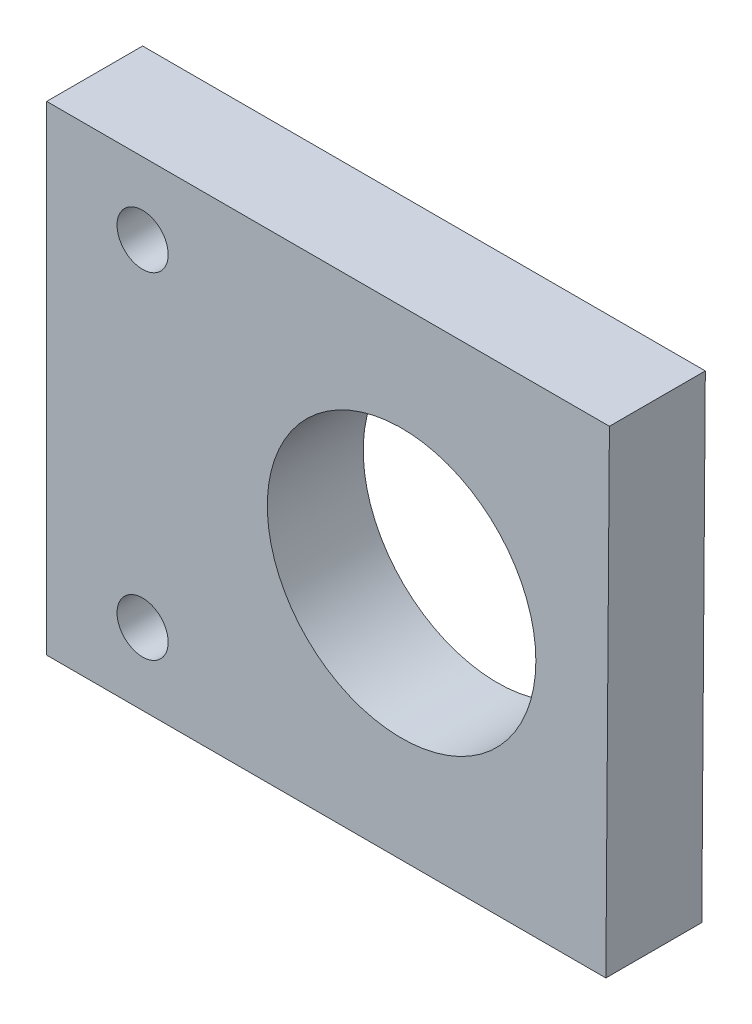
ISO-10303-21;
HEADER;
FILE_DESCRIPTION(('STEP AP214'),'2;1');
FILE_NAME('part.step','',(''),(''),'','','');
FILE_SCHEMA(('AUTOMOTIVE_DESIGN { 1 0 10303 214 1 1 1 1 }'));
ENDSEC;
DATA;
#1=APPLICATION_CONTEXT('core data for automotive mechanical design processes');
#2=APPLICATION_PROTOCOL_DEFINITION('international standard','automotive_design',2000,#1);
#3=PRODUCT_CONTEXT('',#1,'mechanical');
#4=PRODUCT('Part','Part','',(#3));
#5=PRODUCT_RELATED_PRODUCT_CATEGORY('part','',(#4));
#6=PRODUCT_DEFINITION_FORMATION('','',#4);
#7=PRODUCT_DEFINITION_CONTEXT('part definition',#1,'design');
#8=PRODUCT_DEFINITION('design','',#6,#7);
#9=PRODUCT_DEFINITION_SHAPE('','',#8);
#10=(LENGTH_UNIT() NAMED_UNIT(*) SI_UNIT(.MILLI.,.METRE.));
#11=(NAMED_UNIT(*) PLANE_ANGLE_UNIT() SI_UNIT($,.RADIAN.));
#12=(NAMED_UNIT(*) SI_UNIT($,.STERADIAN.) SOLID_ANGLE_UNIT());
#13=UNCERTAINTY_MEASURE_WITH_UNIT(LENGTH_MEASURE(1.E-05),#10,'distance_accuracy_value','');
#14=(GEOMETRIC_REPRESENTATION_CONTEXT(3) GLOBAL_UNCERTAINTY_ASSIGNED_CONTEXT((#13)) GLOBAL_UNIT_ASSIGNED_CONTEXT((#10,
#11,#12)) REPRESENTATION_CONTEXT('',''));
#15=CARTESIAN_POINT('',(0.,0.,0.));
#16=DIRECTION('',(0.,0.,1.));
#17=DIRECTION('',(1.,0.,0.));
#18=AXIS2_PLACEMENT_3D('',#15,#16,#17);
#19=CARTESIAN_POINT('',(0.,-37.5,15.));
#20=DIRECTION('',(0.,-1.,0.));
#21=DIRECTION('',(0.,0.,-1.));
#22=AXIS2_PLACEMENT_3D('',#19,#20,#21);
#23=PLANE('',#22);
#24=DIRECTION('',(-1.,0.,0.));
#25=VECTOR('',#24,1.);
#26=CARTESIAN_POINT('',(0.,-37.5,0.));
#27=LINE('',#26,#25);
#28=CARTESIAN_POINT('',(68.4463548225061,-37.5,0.));
#29=VERTEX_POINT('',#28);
#30=CARTESIAN_POINT('',(-19.,-37.5,0.));
#31=VERTEX_POINT('',#30);
#32=EDGE_CURVE('E113',#29,#31,#27,.T.);
#33=ORIENTED_EDGE('',*,*,#32,.F.);
#34=DIRECTION('',(0.,0.,-1.));
#35=VECTOR('',#34,1.);
#36=CARTESIAN_POINT('',(68.4463548225061,-37.5,15.));
#37=LINE('',#36,#35);
#38=CARTESIAN_POINT('',(68.4463548225061,-37.5,15.));
#39=VERTEX_POINT('',#38);
#40=EDGE_CURVE('E11',#39,#29,#37,.T.);
#41=ORIENTED_EDGE('',*,*,#40,.F.);
#42=DIRECTION('',(-1.,0.,0.));
#43=VECTOR('',#42,1.);
#44=CARTESIAN_POINT('',(0.,-37.5,15.));
#45=LINE('',#44,#43);
#46=CARTESIAN_POINT('',(-19.,-37.5,15.));
#47=VERTEX_POINT('',#46);
#48=EDGE_CURVE('E96',#39,#47,#45,.T.);
#49=ORIENTED_EDGE('',*,*,#48,.T.);
#50=DIRECTION('',(0.,0.,-1.));
#51=VECTOR('',#50,1.);
#52=CARTESIAN_POINT('',(-19.,-37.5,15.));
#53=LINE('',#52,#51);
#54=EDGE_CURVE('E56',#47,#31,#53,.T.);
#55=ORIENTED_EDGE('',*,*,#54,.T.);
#56=EDGE_LOOP('',(#33,#41,#49,#55));
#57=FACE_BOUND('',#56,.T.);
#58=ADVANCED_FACE('F39',(#57),#23,.T.);
#59=CARTESIAN_POINT('',(68.7194326849479,-0.507282433415187,15.));
#60=DIRECTION('',(0.999972754626167,-0.0073817345763211,0.));
#61=DIRECTION('',(0.0073817345763211,0.999972754626167,0.));
#62=AXIS2_PLACEMENT_3D('',#59,#60,#61);
#63=PLANE('',#62);
#64=DIRECTION('',(-0.0073817345763211,-0.999972754626167,0.));
#65=VECTOR('',#64,1.);
#66=CARTESIAN_POINT('',(68.7194326849479,-0.507282433415187,0.));
#67=LINE('',#66,#65);
#68=CARTESIAN_POINT('',(69.,37.5,0.));
#69=VERTEX_POINT('',#68);
#70=EDGE_CURVE('E86',#69,#29,#67,.T.);
#71=ORIENTED_EDGE('',*,*,#70,.F.);
#72=DIRECTION('',(0.,0.,-1.));
#73=VECTOR('',#72,1.);
#74=CARTESIAN_POINT('',(69.,37.5,15.));
#75=LINE('',#74,#73);
#76=CARTESIAN_POINT('',(69.,37.5,15.));
#77=VERTEX_POINT('',#76);
#78=EDGE_CURVE('E48',#77,#69,#75,.T.);
#79=ORIENTED_EDGE('',*,*,#78,.F.);
#80=DIRECTION('',(-0.0073817345763211,-0.999972754626167,0.));
#81=VECTOR('',#80,1.);
#82=CARTESIAN_POINT('',(68.7194326849479,-0.507282433415187,15.));
#83=LINE('',#82,#81);
#84=EDGE_CURVE('E84',#77,#39,#83,.T.);
#85=ORIENTED_EDGE('',*,*,#84,.T.);
#86=ORIENTED_EDGE('',*,*,#40,.T.);
#87=EDGE_LOOP('',(#71,#79,#85,#86));
#88=FACE_BOUND('',#87,.T.);
#89=ADVANCED_FACE('F83',(#88),#63,.T.);
#90=CARTESIAN_POINT('',(0.,37.5,15.));
#91=DIRECTION('',(0.,1.,0.));
#92=DIRECTION('',(0.,0.,1.));
#93=AXIS2_PLACEMENT_3D('',#90,#91,#92);
#94=PLANE('',#93);
#95=DIRECTION('',(1.,0.,0.));
#96=VECTOR('',#95,1.);
#97=CARTESIAN_POINT('',(0.,37.5,0.));
#98=LINE('',#97,#96);
#99=CARTESIAN_POINT('',(-19.,37.5,0.));
#100=VERTEX_POINT('',#99);
#101=EDGE_CURVE('E116',#100,#69,#98,.T.);
#102=ORIENTED_EDGE('',*,*,#101,.F.);
#103=DIRECTION('',(0.,0.,-1.));
#104=VECTOR('',#103,1.);
#105=CARTESIAN_POINT('',(-19.,37.5,15.));
#106=LINE('',#105,#104);
#107=CARTESIAN_POINT('',(-19.,37.5,15.));
#108=VERTEX_POINT('',#107);
#109=EDGE_CURVE('E69',#108,#100,#106,.T.);
#110=ORIENTED_EDGE('',*,*,#109,.F.);
#111=DIRECTION('',(1.,0.,0.));
#112=VECTOR('',#111,1.);
#113=CARTESIAN_POINT('',(0.,37.5,15.));
#114=LINE('',#113,#112);
#115=EDGE_CURVE('E95',#108,#77,#114,.T.);
#116=ORIENTED_EDGE('',*,*,#115,.T.);
#117=ORIENTED_EDGE('',*,*,#78,.T.);
#118=EDGE_LOOP('',(#102,#110,#116,#117));
#119=FACE_BOUND('',#118,.T.);
#120=ADVANCED_FACE('F98',(#119),#94,.T.);
#121=CARTESIAN_POINT('',(-4.,26.25,15.));
#122=DIRECTION('',(0.,0.,-1.));
#123=DIRECTION('',(-1.,0.,0.));
#124=AXIS2_PLACEMENT_3D('',#121,#122,#123);
#125=CYLINDRICAL_SURFACE('',#124,4.);
#126=CARTESIAN_POINT('',(-4.,26.25,15.));
#127=DIRECTION('',(0.,0.,1.));
#128=DIRECTION('',(1.,0.,0.));
#129=AXIS2_PLACEMENT_3D('',#126,#127,#128);
#130=CIRCLE('',#129,4.);
#131=CARTESIAN_POINT('',(0.,26.25,15.));
#132=VERTEX_POINT('',#131);
#133=EDGE_CURVE('E101',#132,#132,#130,.T.);
#134=ORIENTED_EDGE('',*,*,#133,.T.);
#135=EDGE_LOOP('',(#134));
#136=FACE_BOUND('',#135,.T.);
#137=CARTESIAN_POINT('',(-4.,26.25,0.));
#138=DIRECTION('',(0.,0.,1.));
#139=DIRECTION('',(1.,0.,0.));
#140=AXIS2_PLACEMENT_3D('',#137,#138,#139);
#141=CIRCLE('',#140,4.);
#142=CARTESIAN_POINT('',(0.,26.25,0.));
#143=VERTEX_POINT('',#142);
#144=EDGE_CURVE('E121',#143,#143,#141,.T.);
#145=ORIENTED_EDGE('',*,*,#144,.F.);
#146=EDGE_LOOP('',(#145));
#147=FACE_BOUND('',#146,.T.);
#148=ADVANCED_FACE('F137',(#136,#147),#125,.F.);
#149=CARTESIAN_POINT('',(-19.,0.,15.));
#150=DIRECTION('',(-1.,0.,0.));
#151=DIRECTION('',(0.,0.,1.));
#152=AXIS2_PLACEMENT_3D('',#149,#150,#151);
#153=PLANE('',#152);
#154=DIRECTION('',(0.,1.,0.));
#155=VECTOR('',#154,1.);
#156=CARTESIAN_POINT('',(-19.,0.,0.));
#157=LINE('',#156,#155);
#158=EDGE_CURVE('E118',#31,#100,#157,.T.);
#159=ORIENTED_EDGE('',*,*,#158,.F.);
#160=ORIENTED_EDGE('',*,*,#54,.F.);
#161=DIRECTION('',(0.,1.,0.));
#162=VECTOR('',#161,1.);
#163=CARTESIAN_POINT('',(-19.,0.,15.));
#164=LINE('',#163,#162);
#165=EDGE_CURVE('E99',#47,#108,#164,.T.);
#166=ORIENTED_EDGE('',*,*,#165,.T.);
#167=ORIENTED_EDGE('',*,*,#109,.T.);
#168=EDGE_LOOP('',(#159,#160,#166,#167));
#169=FACE_BOUND('',#168,.T.);
#170=ADVANCED_FACE('F135',(#169),#153,.T.);
#171=CARTESIAN_POINT('',(36.5,0.,15.));
#172=DIRECTION('',(0.,0.,-1.));
#173=DIRECTION('',(-1.,0.,0.));
#174=AXIS2_PLACEMENT_3D('',#171,#172,#173);
#175=CYLINDRICAL_SURFACE('',#174,21.);
#176=CARTESIAN_POINT('',(36.5,0.,15.));
#177=DIRECTION('',(0.,0.,1.));
#178=DIRECTION('',(1.,0.,0.));
#179=AXIS2_PLACEMENT_3D('',#176,#177,#178);
#180=CIRCLE('',#179,21.);
#181=CARTESIAN_POINT('',(57.5,0.,15.));
#182=VERTEX_POINT('',#181);
#183=EDGE_CURVE('E127',#182,#182,#180,.T.);
#184=ORIENTED_EDGE('',*,*,#183,.T.);
#185=EDGE_LOOP('',(#184));
#186=FACE_BOUND('',#185,.T.);
#187=CARTESIAN_POINT('',(36.5,0.,0.));
#188=DIRECTION('',(0.,0.,1.));
#189=DIRECTION('',(1.,0.,0.));
#190=AXIS2_PLACEMENT_3D('',#187,#188,#189);
#191=CIRCLE('',#190,21.);
#192=CARTESIAN_POINT('',(57.5,0.,0.));
#193=VERTEX_POINT('',#192);
#194=EDGE_CURVE('E110',#193,#193,#191,.T.);
#195=ORIENTED_EDGE('',*,*,#194,.F.);
#196=EDGE_LOOP('',(#195));
#197=FACE_BOUND('',#196,.T.);
#198=ADVANCED_FACE('F41',(#186,#197),#175,.F.);
#199=CARTESIAN_POINT('',(-4.,-26.25,15.));
#200=DIRECTION('',(0.,0.,-1.));
#201=DIRECTION('',(-1.,0.,0.));
#202=AXIS2_PLACEMENT_3D('',#199,#200,#201);
#203=CYLINDRICAL_SURFACE('',#202,4.);
#204=CARTESIAN_POINT('',(-4.,-26.25,15.));
#205=DIRECTION('',(0.,0.,1.));
#206=DIRECTION('',(1.,0.,0.));
#207=AXIS2_PLACEMENT_3D('',#204,#205,#206);
#208=CIRCLE('',#207,4.);
#209=CARTESIAN_POINT('',(0.,-26.25,15.));
#210=VERTEX_POINT('',#209);
#211=EDGE_CURVE('E107',#210,#210,#208,.F.);
#212=ORIENTED_EDGE('',*,*,#211,.F.);
#213=EDGE_LOOP('',(#212));
#214=FACE_BOUND('',#213,.T.);
#215=CARTESIAN_POINT('',(-4.,-26.25,0.));
#216=DIRECTION('',(0.,0.,1.));
#217=DIRECTION('',(1.,0.,0.));
#218=AXIS2_PLACEMENT_3D('',#215,#216,#217);
#219=CIRCLE('',#218,4.);
#220=CARTESIAN_POINT('',(0.,-26.25,0.));
#221=VERTEX_POINT('',#220);
#222=EDGE_CURVE('E124',#221,#221,#219,.F.);
#223=ORIENTED_EDGE('',*,*,#222,.T.);
#224=EDGE_LOOP('',(#223));
#225=FACE_BOUND('',#224,.T.);
#226=ADVANCED_FACE('F143',(#214,#225),#203,.F.);
#227=CARTESIAN_POINT('',(0.,0.,15.));
#228=DIRECTION('',(0.,0.,1.));
#229=DIRECTION('',(1.,0.,0.));
#230=AXIS2_PLACEMENT_3D('',#227,#228,#229);
#231=PLANE('',#230);
#232=ORIENTED_EDGE('',*,*,#183,.F.);
#233=EDGE_LOOP('',(#232));
#234=FACE_BOUND('',#233,.T.);
#235=ORIENTED_EDGE('',*,*,#48,.F.);
#236=ORIENTED_EDGE('',*,*,#84,.F.);
#237=ORIENTED_EDGE('',*,*,#115,.F.);
#238=ORIENTED_EDGE('',*,*,#165,.F.);
#239=EDGE_LOOP('',(#235,#236,#237,#238));
#240=FACE_BOUND('',#239,.T.);
#241=ORIENTED_EDGE('',*,*,#133,.F.);
#242=EDGE_LOOP('',(#241));
#243=FACE_BOUND('',#242,.T.);
#244=ORIENTED_EDGE('',*,*,#211,.T.);
#245=EDGE_LOOP('',(#244));
#246=FACE_BOUND('',#245,.T.);
#247=ADVANCED_FACE('F92',(#234,#240,#243,#246),#231,.T.);
#248=CARTESIAN_POINT('',(0.,0.,0.));
#249=DIRECTION('',(0.,0.,1.));
#250=DIRECTION('',(1.,0.,0.));
#251=AXIS2_PLACEMENT_3D('',#248,#249,#250);
#252=PLANE('',#251);
#253=ORIENTED_EDGE('',*,*,#194,.T.);
#254=EDGE_LOOP('',(#253));
#255=FACE_BOUND('',#254,.T.);
#256=ORIENTED_EDGE('',*,*,#32,.T.);
#257=ORIENTED_EDGE('',*,*,#158,.T.);
#258=ORIENTED_EDGE('',*,*,#101,.T.);
#259=ORIENTED_EDGE('',*,*,#70,.T.);
#260=EDGE_LOOP('',(#256,#257,#258,#259));
#261=FACE_BOUND('',#260,.T.);
#262=ORIENTED_EDGE('',*,*,#144,.T.);
#263=EDGE_LOOP('',(#262));
#264=FACE_BOUND('',#263,.T.);
#265=ORIENTED_EDGE('',*,*,#222,.F.);
#266=EDGE_LOOP('',(#265));
#267=FACE_BOUND('',#266,.T.);
#268=ADVANCED_FACE('F193',(#255,#261,#264,#267),#252,.F.);
#269=CLOSED_SHELL('',(#58,#89,#120,#148,#170,#198,#226,#247,#268));
#270=MANIFOLD_SOLID_BREP('B2',#269);
#271=ADVANCED_BREP_SHAPE_REPRESENTATION('',(#18,#270),#14);
#272=SHAPE_DEFINITION_REPRESENTATION(#9,#271);
ENDSEC;
END-ISO-10303-21;
